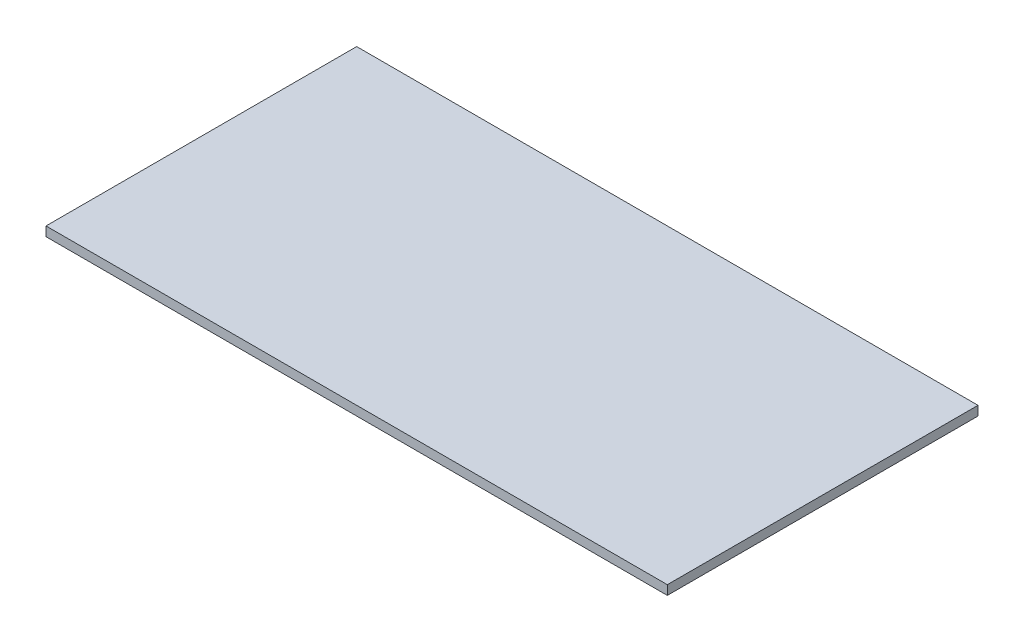
ISO-10303-21;
HEADER;
FILE_DESCRIPTION(('STEP AP214'),'2;1');
FILE_NAME('part.step','',(''),(''),'','','');
FILE_SCHEMA(('AUTOMOTIVE_DESIGN { 1 0 10303 214 1 1 1 1 }'));
ENDSEC;
DATA;
#1=APPLICATION_CONTEXT('core data for automotive mechanical design processes');
#2=APPLICATION_PROTOCOL_DEFINITION('international standard','automotive_design',2000,#1);
#3=PRODUCT_CONTEXT('',#1,'mechanical');
#4=PRODUCT('Part','Part','',(#3));
#5=PRODUCT_RELATED_PRODUCT_CATEGORY('part','',(#4));
#6=PRODUCT_DEFINITION_FORMATION('','',#4);
#7=PRODUCT_DEFINITION_CONTEXT('part definition',#1,'design');
#8=PRODUCT_DEFINITION('design','',#6,#7);
#9=PRODUCT_DEFINITION_SHAPE('','',#8);
#10=(LENGTH_UNIT() NAMED_UNIT(*) SI_UNIT(.MILLI.,.METRE.));
#11=(NAMED_UNIT(*) PLANE_ANGLE_UNIT() SI_UNIT($,.RADIAN.));
#12=(NAMED_UNIT(*) SI_UNIT($,.STERADIAN.) SOLID_ANGLE_UNIT());
#13=UNCERTAINTY_MEASURE_WITH_UNIT(LENGTH_MEASURE(1.E-05),#10,'distance_accuracy_value','');
#14=(GEOMETRIC_REPRESENTATION_CONTEXT(3) GLOBAL_UNCERTAINTY_ASSIGNED_CONTEXT((#13)) GLOBAL_UNIT_ASSIGNED_CONTEXT((#10,
#11,#12)) REPRESENTATION_CONTEXT('',''));
#15=CARTESIAN_POINT('',(0.,0.,0.));
#16=DIRECTION('',(0.,0.,1.));
#17=DIRECTION('',(1.,0.,0.));
#18=AXIS2_PLACEMENT_3D('',#15,#16,#17);
#19=CARTESIAN_POINT('',(100.,3.,50.));
#20=DIRECTION('',(-1.,0.,0.));
#21=DIRECTION('',(0.,0.,1.));
#22=AXIS2_PLACEMENT_3D('',#19,#20,#21);
#23=PLANE('',#22);
#24=DIRECTION('',(0.,0.,-1.));
#25=VECTOR('',#24,1.);
#26=CARTESIAN_POINT('',(100.,0.,50.));
#27=LINE('',#26,#25);
#28=CARTESIAN_POINT('',(100.,0.,50.));
#29=VERTEX_POINT('',#28);
#30=CARTESIAN_POINT('',(100.,0.,-50.));
#31=VERTEX_POINT('',#30);
#32=EDGE_CURVE('E97',#29,#31,#27,.T.);
#33=ORIENTED_EDGE('',*,*,#32,.T.);
#34=DIRECTION('',(0.,-1.,0.));
#35=VECTOR('',#34,1.);
#36=CARTESIAN_POINT('',(100.,3.,-50.));
#37=LINE('',#36,#35);
#38=CARTESIAN_POINT('',(100.,3.,-50.));
#39=VERTEX_POINT('',#38);
#40=EDGE_CURVE('E11',#39,#31,#37,.T.);
#41=ORIENTED_EDGE('',*,*,#40,.F.);
#42=DIRECTION('',(0.,0.,-1.));
#43=VECTOR('',#42,1.);
#44=CARTESIAN_POINT('',(100.,3.,50.));
#45=LINE('',#44,#43);
#46=CARTESIAN_POINT('',(100.,3.,50.));
#47=VERTEX_POINT('',#46);
#48=EDGE_CURVE('E85',#47,#39,#45,.T.);
#49=ORIENTED_EDGE('',*,*,#48,.F.);
#50=DIRECTION('',(0.,-1.,0.));
#51=VECTOR('',#50,1.);
#52=CARTESIAN_POINT('',(100.,3.,50.));
#53=LINE('',#52,#51);
#54=EDGE_CURVE('E93',#47,#29,#53,.T.);
#55=ORIENTED_EDGE('',*,*,#54,.T.);
#56=EDGE_LOOP('',(#33,#41,#49,#55));
#57=FACE_BOUND('',#56,.T.);
#58=ADVANCED_FACE('F34',(#57),#23,.F.);
#59=CARTESIAN_POINT('',(-100.,3.,-50.));
#60=DIRECTION('',(0.,0.,1.));
#61=DIRECTION('',(1.,0.,0.));
#62=AXIS2_PLACEMENT_3D('',#59,#60,#61);
#63=PLANE('',#62);
#64=DIRECTION('',(-1.,0.,0.));
#65=VECTOR('',#64,1.);
#66=CARTESIAN_POINT('',(-100.,0.,-50.));
#67=LINE('',#66,#65);
#68=CARTESIAN_POINT('',(-100.,0.,-50.));
#69=VERTEX_POINT('',#68);
#70=EDGE_CURVE('E89',#31,#69,#67,.T.);
#71=ORIENTED_EDGE('',*,*,#70,.T.);
#72=DIRECTION('',(0.,-1.,0.));
#73=VECTOR('',#72,1.);
#74=CARTESIAN_POINT('',(-100.,3.,-50.));
#75=LINE('',#74,#73);
#76=CARTESIAN_POINT('',(-100.,3.,-50.));
#77=VERTEX_POINT('',#76);
#78=EDGE_CURVE('E42',#77,#69,#75,.T.);
#79=ORIENTED_EDGE('',*,*,#78,.F.);
#80=DIRECTION('',(-1.,0.,0.));
#81=VECTOR('',#80,1.);
#82=CARTESIAN_POINT('',(-100.,3.,-50.));
#83=LINE('',#82,#81);
#84=EDGE_CURVE('E80',#39,#77,#83,.T.);
#85=ORIENTED_EDGE('',*,*,#84,.F.);
#86=ORIENTED_EDGE('',*,*,#40,.T.);
#87=EDGE_LOOP('',(#71,#79,#85,#86));
#88=FACE_BOUND('',#87,.T.);
#89=ADVANCED_FACE('F88',(#88),#63,.F.);
#90=CARTESIAN_POINT('',(-100.,3.,50.));
#91=DIRECTION('',(1.,0.,0.));
#92=DIRECTION('',(0.,0.,-1.));
#93=AXIS2_PLACEMENT_3D('',#90,#91,#92);
#94=PLANE('',#93);
#95=DIRECTION('',(0.,0.,1.));
#96=VECTOR('',#95,1.);
#97=CARTESIAN_POINT('',(-100.,0.,50.));
#98=LINE('',#97,#96);
#99=CARTESIAN_POINT('',(-100.,0.,50.));
#100=VERTEX_POINT('',#99);
#101=EDGE_CURVE('E67',#69,#100,#98,.T.);
#102=ORIENTED_EDGE('',*,*,#101,.T.);
#103=DIRECTION('',(0.,-1.,0.));
#104=VECTOR('',#103,1.);
#105=CARTESIAN_POINT('',(-100.,3.,50.));
#106=LINE('',#105,#104);
#107=CARTESIAN_POINT('',(-100.,3.,50.));
#108=VERTEX_POINT('',#107);
#109=EDGE_CURVE('E90',#108,#100,#106,.T.);
#110=ORIENTED_EDGE('',*,*,#109,.F.);
#111=DIRECTION('',(0.,0.,1.));
#112=VECTOR('',#111,1.);
#113=CARTESIAN_POINT('',(-100.,3.,50.));
#114=LINE('',#113,#112);
#115=EDGE_CURVE('E83',#77,#108,#114,.T.);
#116=ORIENTED_EDGE('',*,*,#115,.F.);
#117=ORIENTED_EDGE('',*,*,#78,.T.);
#118=EDGE_LOOP('',(#102,#110,#116,#117));
#119=FACE_BOUND('',#118,.T.);
#120=ADVANCED_FACE('F91',(#119),#94,.F.);
#121=CARTESIAN_POINT('',(-100.,3.,50.));
#122=DIRECTION('',(0.,0.,-1.));
#123=DIRECTION('',(-1.,0.,0.));
#124=AXIS2_PLACEMENT_3D('',#121,#122,#123);
#125=PLANE('',#124);
#126=DIRECTION('',(1.,0.,0.));
#127=VECTOR('',#126,1.);
#128=CARTESIAN_POINT('',(-100.,0.,50.));
#129=LINE('',#128,#127);
#130=EDGE_CURVE('E73',#100,#29,#129,.T.);
#131=ORIENTED_EDGE('',*,*,#130,.T.);
#132=ORIENTED_EDGE('',*,*,#54,.F.);
#133=DIRECTION('',(1.,0.,0.));
#134=VECTOR('',#133,1.);
#135=CARTESIAN_POINT('',(-100.,3.,50.));
#136=LINE('',#135,#134);
#137=EDGE_CURVE('E50',#108,#47,#136,.T.);
#138=ORIENTED_EDGE('',*,*,#137,.F.);
#139=ORIENTED_EDGE('',*,*,#109,.T.);
#140=EDGE_LOOP('',(#131,#132,#138,#139));
#141=FACE_BOUND('',#140,.T.);
#142=ADVANCED_FACE('F104',(#141),#125,.F.);
#143=CARTESIAN_POINT('',(0.,3.,0.));
#144=DIRECTION('',(0.,-1.,0.));
#145=DIRECTION('',(0.,0.,-1.));
#146=AXIS2_PLACEMENT_3D('',#143,#144,#145);
#147=PLANE('',#146);
#148=ORIENTED_EDGE('',*,*,#48,.T.);
#149=ORIENTED_EDGE('',*,*,#84,.T.);
#150=ORIENTED_EDGE('',*,*,#115,.T.);
#151=ORIENTED_EDGE('',*,*,#137,.T.);
#152=EDGE_LOOP('',(#148,#149,#150,#151));
#153=FACE_BOUND('',#152,.T.);
#154=ADVANCED_FACE('F81',(#153),#147,.F.);
#155=CARTESIAN_POINT('',(0.,0.,0.));
#156=DIRECTION('',(0.,-1.,0.));
#157=DIRECTION('',(0.,0.,-1.));
#158=AXIS2_PLACEMENT_3D('',#155,#156,#157);
#159=PLANE('',#158);
#160=ORIENTED_EDGE('',*,*,#32,.F.);
#161=ORIENTED_EDGE('',*,*,#130,.F.);
#162=ORIENTED_EDGE('',*,*,#101,.F.);
#163=ORIENTED_EDGE('',*,*,#70,.F.);
#164=EDGE_LOOP('',(#160,#161,#162,#163));
#165=FACE_BOUND('',#164,.T.);
#166=ADVANCED_FACE('F107',(#165),#159,.T.);
#167=CLOSED_SHELL('',(#58,#89,#120,#142,#154,#166));
#168=MANIFOLD_SOLID_BREP('B2',#167);
#169=ADVANCED_BREP_SHAPE_REPRESENTATION('',(#18,#168),#14);
#170=SHAPE_DEFINITION_REPRESENTATION(#9,#169);
ENDSEC;
END-ISO-10303-21;
